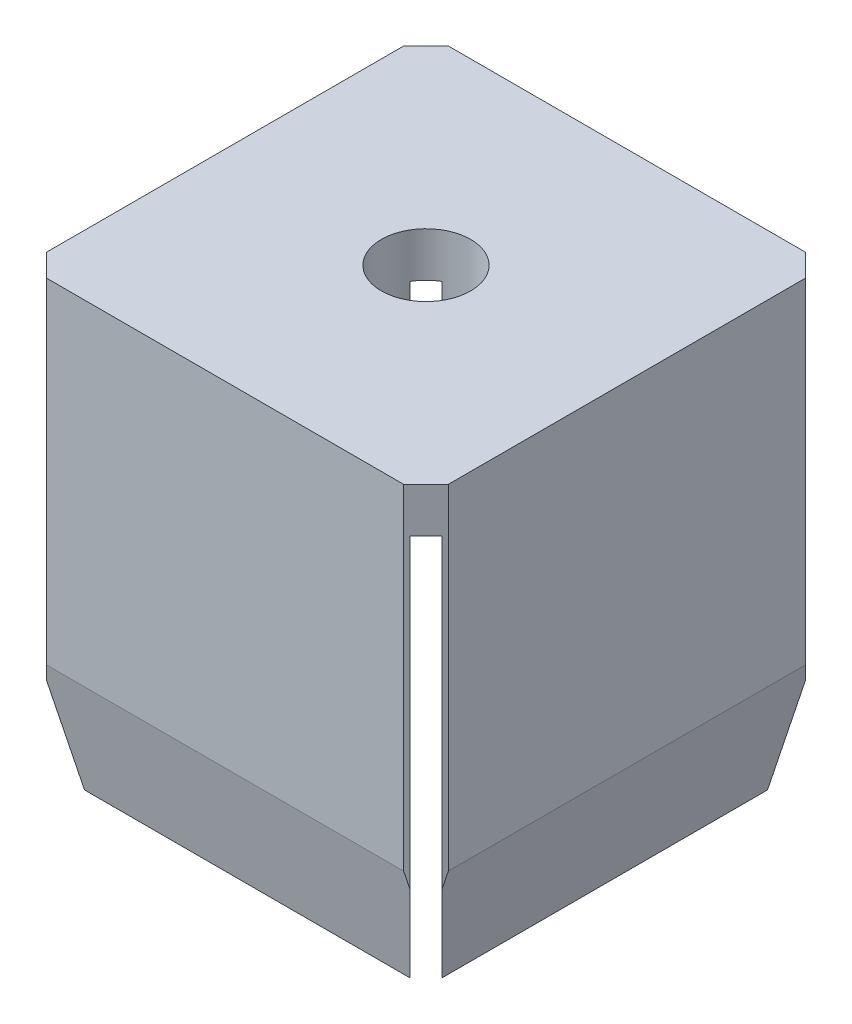
ISO-10303-21;
HEADER;
FILE_DESCRIPTION(('STEP AP214'),'2;1');
FILE_NAME('part.step','',(''),(''),'','','');
FILE_SCHEMA(('AUTOMOTIVE_DESIGN { 1 0 10303 214 1 1 1 1 }'));
ENDSEC;
DATA;
#1=APPLICATION_CONTEXT('core data for automotive mechanical design processes');
#2=APPLICATION_PROTOCOL_DEFINITION('international standard','automotive_design',2000,#1);
#3=PRODUCT_CONTEXT('',#1,'mechanical');
#4=PRODUCT('Part','Part','',(#3));
#5=PRODUCT_RELATED_PRODUCT_CATEGORY('part','',(#4));
#6=PRODUCT_DEFINITION_FORMATION('','',#4);
#7=PRODUCT_DEFINITION_CONTEXT('part definition',#1,'design');
#8=PRODUCT_DEFINITION('design','',#6,#7);
#9=PRODUCT_DEFINITION_SHAPE('','',#8);
#10=(LENGTH_UNIT() NAMED_UNIT(*) SI_UNIT(.MILLI.,.METRE.));
#11=(NAMED_UNIT(*) PLANE_ANGLE_UNIT() SI_UNIT($,.RADIAN.));
#12=(NAMED_UNIT(*) SI_UNIT($,.STERADIAN.) SOLID_ANGLE_UNIT());
#13=UNCERTAINTY_MEASURE_WITH_UNIT(LENGTH_MEASURE(1.E-05),#10,'distance_accuracy_value','');
#14=(GEOMETRIC_REPRESENTATION_CONTEXT(3) GLOBAL_UNCERTAINTY_ASSIGNED_CONTEXT((#13)) GLOBAL_UNIT_ASSIGNED_CONTEXT((#10,
#11,#12)) REPRESENTATION_CONTEXT('',''));
#15=CARTESIAN_POINT('',(0.,0.,0.));
#16=DIRECTION('',(0.,0.,1.));
#17=DIRECTION('',(1.,0.,0.));
#18=AXIS2_PLACEMENT_3D('',#15,#16,#17);
#19=CARTESIAN_POINT('',(0.,0.,0.));
#20=DIRECTION('',(0.,-1.,0.));
#21=DIRECTION('',(0.,0.,-1.));
#22=AXIS2_PLACEMENT_3D('',#19,#20,#21);
#23=PLANE('',#22);
#24=DIRECTION('',(0.707106781186548,0.,-0.707106781186547));
#25=VECTOR('',#24,1.);
#26=CARTESIAN_POINT('',(1.4142135623731,0.,0.));
#27=LINE('',#26,#25);
#28=CARTESIAN_POINT('',(3.44571956871237,0.,-2.03150600633928));
#29=VERTEX_POINT('',#28);
#30=CARTESIAN_POINT('',(16.,0.,-14.5857864376269));
#31=VERTEX_POINT('',#30);
#32=EDGE_CURVE('E474',#29,#31,#27,.T.);
#33=ORIENTED_EDGE('',*,*,#32,.T.);
#34=DIRECTION('',(0.,0.,1.));
#35=VECTOR('',#34,1.);
#36=CARTESIAN_POINT('',(16.,0.,16.));
#37=LINE('',#36,#35);
#38=CARTESIAN_POINT('',(16.,0.,14.5857864376269));
#39=VERTEX_POINT('',#38);
#40=EDGE_CURVE('E387',#31,#39,#37,.T.);
#41=ORIENTED_EDGE('',*,*,#40,.T.);
#42=DIRECTION('',(-0.707106781186548,0.,-0.707106781186548));
#43=VECTOR('',#42,1.);
#44=CARTESIAN_POINT('',(1.4142135623731,0.,0.));
#45=LINE('',#44,#43);
#46=CARTESIAN_POINT('',(3.44571956871238,0.,2.03150600633927));
#47=VERTEX_POINT('',#46);
#48=EDGE_CURVE('E472',#39,#47,#45,.T.);
#49=ORIENTED_EDGE('',*,*,#48,.T.);
#50=CARTESIAN_POINT('',(0.,0.,0.));
#51=DIRECTION('',(0.,1.,0.));
#52=DIRECTION('',(0.,0.,1.));
#53=AXIS2_PLACEMENT_3D('',#50,#51,#52);
#54=CIRCLE('',#53,4.);
#55=EDGE_CURVE('E263',#47,#29,#54,.T.);
#56=ORIENTED_EDGE('',*,*,#55,.T.);
#57=EDGE_LOOP('',(#33,#41,#49,#56));
#58=FACE_BOUND('',#57,.T.);
#59=ADVANCED_FACE('F47',(#58),#23,.T.);
#60=DIRECTION('',(-0.707106781186548,0.,-0.707106781186547));
#61=VECTOR('',#60,1.);
#62=CARTESIAN_POINT('',(-18.5857864376269,0.,-20.));
#63=LINE('',#62,#61);
#64=CARTESIAN_POINT('',(-2.03150600633928,0.,-3.44571956871238));
#65=VERTEX_POINT('',#64);
#66=CARTESIAN_POINT('',(-14.5857864376269,0.,-16.));
#67=VERTEX_POINT('',#66);
#68=EDGE_CURVE('E281',#65,#67,#63,.T.);
#69=ORIENTED_EDGE('',*,*,#68,.T.);
#70=DIRECTION('',(1.,0.,0.));
#71=VECTOR('',#70,1.);
#72=CARTESIAN_POINT('',(16.,0.,-16.));
#73=LINE('',#72,#71);
#74=CARTESIAN_POINT('',(14.5857864376269,0.,-16.));
#75=VERTEX_POINT('',#74);
#76=EDGE_CURVE('E374',#67,#75,#73,.T.);
#77=ORIENTED_EDGE('',*,*,#76,.T.);
#78=DIRECTION('',(-0.707106781186548,0.,0.707106781186547));
#79=VECTOR('',#78,1.);
#80=CARTESIAN_POINT('',(0.,0.,-1.4142135623731));
#81=LINE('',#80,#79);
#82=CARTESIAN_POINT('',(2.03150600633928,0.,-3.44571956871238));
#83=VERTEX_POINT('',#82);
#84=EDGE_CURVE('E284',#75,#83,#81,.T.);
#85=ORIENTED_EDGE('',*,*,#84,.T.);
#86=EDGE_CURVE('E265',#83,#65,#54,.T.);
#87=ORIENTED_EDGE('',*,*,#86,.T.);
#88=EDGE_LOOP('',(#69,#77,#85,#87));
#89=FACE_BOUND('',#88,.T.);
#90=ADVANCED_FACE('F280',(#89),#23,.T.);
#91=DIRECTION('',(-0.707106781186548,0.,0.707106781186548));
#92=VECTOR('',#91,1.);
#93=CARTESIAN_POINT('',(-20.,0.,18.5857864376269));
#94=LINE('',#93,#92);
#95=CARTESIAN_POINT('',(-3.44571956871238,0.,2.03150600633929));
#96=VERTEX_POINT('',#95);
#97=CARTESIAN_POINT('',(-16.,0.,14.5857864376269));
#98=VERTEX_POINT('',#97);
#99=EDGE_CURVE('E479',#96,#98,#94,.T.);
#100=ORIENTED_EDGE('',*,*,#99,.T.);
#101=DIRECTION('',(0.,0.,-1.));
#102=VECTOR('',#101,1.);
#103=CARTESIAN_POINT('',(-16.,0.,-16.));
#104=LINE('',#103,#102);
#105=CARTESIAN_POINT('',(-16.,0.,-14.5857864376269));
#106=VERTEX_POINT('',#105);
#107=EDGE_CURVE('E55',#98,#106,#104,.T.);
#108=ORIENTED_EDGE('',*,*,#107,.T.);
#109=DIRECTION('',(0.707106781186548,0.,0.707106781186547));
#110=VECTOR('',#109,1.);
#111=CARTESIAN_POINT('',(-20.,0.,-18.5857864376269));
#112=LINE('',#111,#110);
#113=CARTESIAN_POINT('',(-3.44571956871238,0.,-2.03150600633929));
#114=VERTEX_POINT('',#113);
#115=EDGE_CURVE('E460',#106,#114,#112,.T.);
#116=ORIENTED_EDGE('',*,*,#115,.T.);
#117=EDGE_CURVE('E260',#114,#96,#54,.T.);
#118=ORIENTED_EDGE('',*,*,#117,.T.);
#119=EDGE_LOOP('',(#100,#108,#116,#118));
#120=FACE_BOUND('',#119,.T.);
#121=ADVANCED_FACE('F481',(#120),#23,.T.);
#122=DIRECTION('',(0.707106781186548,0.,0.707106781186547));
#123=VECTOR('',#122,1.);
#124=CARTESIAN_POINT('',(0.,0.,1.4142135623731));
#125=LINE('',#124,#123);
#126=CARTESIAN_POINT('',(2.03150600633928,0.,3.44571956871237));
#127=VERTEX_POINT('',#126);
#128=CARTESIAN_POINT('',(14.5857864376269,0.,16.));
#129=VERTEX_POINT('',#128);
#130=EDGE_CURVE('E231',#127,#129,#125,.T.);
#131=ORIENTED_EDGE('',*,*,#130,.T.);
#132=DIRECTION('',(-1.,0.,0.));
#133=VECTOR('',#132,1.);
#134=CARTESIAN_POINT('',(-16.,0.,16.));
#135=LINE('',#134,#133);
#136=CARTESIAN_POINT('',(-14.5857864376269,0.,16.));
#137=VERTEX_POINT('',#136);
#138=EDGE_CURVE('E399',#129,#137,#135,.T.);
#139=ORIENTED_EDGE('',*,*,#138,.T.);
#140=DIRECTION('',(0.707106781186548,0.,-0.707106781186548));
#141=VECTOR('',#140,1.);
#142=CARTESIAN_POINT('',(-18.5857864376269,0.,20.));
#143=LINE('',#142,#141);
#144=CARTESIAN_POINT('',(-2.03150600633928,0.,3.44571956871238));
#145=VERTEX_POINT('',#144);
#146=EDGE_CURVE('E244',#137,#145,#143,.T.);
#147=ORIENTED_EDGE('',*,*,#146,.T.);
#148=EDGE_CURVE('E251',#145,#127,#54,.T.);
#149=ORIENTED_EDGE('',*,*,#148,.T.);
#150=EDGE_LOOP('',(#131,#139,#147,#149));
#151=FACE_BOUND('',#150,.T.);
#152=ADVANCED_FACE('F257',(#151),#23,.T.);
#153=CARTESIAN_POINT('',(18.,40.,18.));
#154=DIRECTION('',(-1.,0.,0.));
#155=DIRECTION('',(0.,0.,1.));
#156=AXIS2_PLACEMENT_3D('',#153,#154,#155);
#157=PLANE('',#156);
#158=DIRECTION('',(0.,-1.,0.));
#159=VECTOR('',#158,1.);
#160=CARTESIAN_POINT('',(18.,40.,16.));
#161=LINE('',#160,#159);
#162=CARTESIAN_POINT('',(18.,40.,16.));
#163=VERTEX_POINT('',#162);
#164=CARTESIAN_POINT('',(18.,10.0000000000002,16.));
#165=VERTEX_POINT('',#164);
#166=EDGE_CURVE('E343',#163,#165,#161,.T.);
#167=ORIENTED_EDGE('',*,*,#166,.T.);
#168=DIRECTION('',(0.,0.,-1.));
#169=VECTOR('',#168,1.);
#170=CARTESIAN_POINT('',(18.,10.0000000000002,-16.));
#171=LINE('',#170,#169);
#172=CARTESIAN_POINT('',(18.,10.0000000000002,-16.));
#173=VERTEX_POINT('',#172);
#174=EDGE_CURVE('E382',#165,#173,#171,.T.);
#175=ORIENTED_EDGE('',*,*,#174,.T.);
#176=DIRECTION('',(0.,1.,0.));
#177=VECTOR('',#176,1.);
#178=CARTESIAN_POINT('',(18.,40.,-16.));
#179=LINE('',#178,#177);
#180=CARTESIAN_POINT('',(18.,40.,-16.));
#181=VERTEX_POINT('',#180);
#182=EDGE_CURVE('E346',#173,#181,#179,.T.);
#183=ORIENTED_EDGE('',*,*,#182,.T.);
#184=DIRECTION('',(0.,0.,-1.));
#185=VECTOR('',#184,1.);
#186=CARTESIAN_POINT('',(18.,40.,18.));
#187=LINE('',#186,#185);
#188=EDGE_CURVE('E275',#163,#181,#187,.T.);
#189=ORIENTED_EDGE('',*,*,#188,.F.);
#190=EDGE_LOOP('',(#167,#175,#183,#189));
#191=FACE_BOUND('',#190,.T.);
#192=ADVANCED_FACE('F554',(#191),#157,.F.);
#193=CARTESIAN_POINT('',(-18.,40.,-18.));
#194=DIRECTION('',(0.,0.,1.));
#195=DIRECTION('',(1.,0.,0.));
#196=AXIS2_PLACEMENT_3D('',#193,#194,#195);
#197=PLANE('',#196);
#198=DIRECTION('',(0.,-1.,0.));
#199=VECTOR('',#198,1.);
#200=CARTESIAN_POINT('',(16.,40.,-18.));
#201=LINE('',#200,#199);
#202=CARTESIAN_POINT('',(16.,40.,-18.));
#203=VERTEX_POINT('',#202);
#204=CARTESIAN_POINT('',(16.,10.0000000000002,-18.));
#205=VERTEX_POINT('',#204);
#206=EDGE_CURVE('E323',#203,#205,#201,.T.);
#207=ORIENTED_EDGE('',*,*,#206,.T.);
#208=DIRECTION('',(-1.,0.,0.));
#209=VECTOR('',#208,1.);
#210=CARTESIAN_POINT('',(-16.,10.0000000000002,-18.));
#211=LINE('',#210,#209);
#212=CARTESIAN_POINT('',(-16.,10.0000000000002,-18.));
#213=VERTEX_POINT('',#212);
#214=EDGE_CURVE('E365',#205,#213,#211,.T.);
#215=ORIENTED_EDGE('',*,*,#214,.T.);
#216=DIRECTION('',(0.,1.,0.));
#217=VECTOR('',#216,1.);
#218=CARTESIAN_POINT('',(-16.,40.,-18.));
#219=LINE('',#218,#217);
#220=CARTESIAN_POINT('',(-16.,40.,-18.));
#221=VERTEX_POINT('',#220);
#222=EDGE_CURVE('E326',#213,#221,#219,.T.);
#223=ORIENTED_EDGE('',*,*,#222,.T.);
#224=DIRECTION('',(-1.,0.,0.));
#225=VECTOR('',#224,1.);
#226=CARTESIAN_POINT('',(-18.,40.,-18.));
#227=LINE('',#226,#225);
#228=EDGE_CURVE('E442',#203,#221,#227,.T.);
#229=ORIENTED_EDGE('',*,*,#228,.F.);
#230=EDGE_LOOP('',(#207,#215,#223,#229));
#231=FACE_BOUND('',#230,.T.);
#232=ADVANCED_FACE('F559',(#231),#197,.F.);
#233=CARTESIAN_POINT('',(-18.,40.,18.));
#234=DIRECTION('',(1.,0.,0.));
#235=DIRECTION('',(0.,0.,-1.));
#236=AXIS2_PLACEMENT_3D('',#233,#234,#235);
#237=PLANE('',#236);
#238=DIRECTION('',(0.,-1.,0.));
#239=VECTOR('',#238,1.);
#240=CARTESIAN_POINT('',(-18.,40.,-16.));
#241=LINE('',#240,#239);
#242=CARTESIAN_POINT('',(-18.,40.,-16.));
#243=VERTEX_POINT('',#242);
#244=CARTESIAN_POINT('',(-18.,10.0000000000002,-16.));
#245=VERTEX_POINT('',#244);
#246=EDGE_CURVE('E313',#243,#245,#241,.T.);
#247=ORIENTED_EDGE('',*,*,#246,.T.);
#248=DIRECTION('',(0.,0.,1.));
#249=VECTOR('',#248,1.);
#250=CARTESIAN_POINT('',(-18.,10.0000000000002,16.));
#251=LINE('',#250,#249);
#252=CARTESIAN_POINT('',(-18.,10.0000000000002,16.));
#253=VERTEX_POINT('',#252);
#254=EDGE_CURVE('E407',#245,#253,#251,.T.);
#255=ORIENTED_EDGE('',*,*,#254,.T.);
#256=DIRECTION('',(0.,1.,0.));
#257=VECTOR('',#256,1.);
#258=CARTESIAN_POINT('',(-18.,40.,16.));
#259=LINE('',#258,#257);
#260=CARTESIAN_POINT('',(-18.,40.,16.));
#261=VERTEX_POINT('',#260);
#262=EDGE_CURVE('E311',#253,#261,#259,.T.);
#263=ORIENTED_EDGE('',*,*,#262,.T.);
#264=DIRECTION('',(0.,0.,1.));
#265=VECTOR('',#264,1.);
#266=CARTESIAN_POINT('',(-18.,40.,18.));
#267=LINE('',#266,#265);
#268=EDGE_CURVE('E433',#243,#261,#267,.T.);
#269=ORIENTED_EDGE('',*,*,#268,.F.);
#270=EDGE_LOOP('',(#247,#255,#263,#269));
#271=FACE_BOUND('',#270,.T.);
#272=ADVANCED_FACE('F413',(#271),#237,.F.);
#273=CARTESIAN_POINT('',(-18.,40.,18.));
#274=DIRECTION('',(0.,0.,-1.));
#275=DIRECTION('',(-1.,0.,0.));
#276=AXIS2_PLACEMENT_3D('',#273,#274,#275);
#277=PLANE('',#276);
#278=DIRECTION('',(0.,-1.,0.));
#279=VECTOR('',#278,1.);
#280=CARTESIAN_POINT('',(-16.,40.,18.));
#281=LINE('',#280,#279);
#282=CARTESIAN_POINT('',(-16.,40.,18.));
#283=VERTEX_POINT('',#282);
#284=CARTESIAN_POINT('',(-16.,10.0000000000002,18.));
#285=VERTEX_POINT('',#284);
#286=EDGE_CURVE('E350',#283,#285,#281,.T.);
#287=ORIENTED_EDGE('',*,*,#286,.T.);
#288=DIRECTION('',(1.,0.,0.));
#289=VECTOR('',#288,1.);
#290=CARTESIAN_POINT('',(16.,10.0000000000002,18.));
#291=LINE('',#290,#289);
#292=CARTESIAN_POINT('',(16.,10.0000000000002,18.));
#293=VERTEX_POINT('',#292);
#294=EDGE_CURVE('E395',#285,#293,#291,.T.);
#295=ORIENTED_EDGE('',*,*,#294,.T.);
#296=DIRECTION('',(0.,1.,0.));
#297=VECTOR('',#296,1.);
#298=CARTESIAN_POINT('',(16.,40.,18.));
#299=LINE('',#298,#297);
#300=CARTESIAN_POINT('',(16.,40.,18.));
#301=VERTEX_POINT('',#300);
#302=EDGE_CURVE('E348',#293,#301,#299,.T.);
#303=ORIENTED_EDGE('',*,*,#302,.T.);
#304=DIRECTION('',(1.,0.,0.));
#305=VECTOR('',#304,1.);
#306=CARTESIAN_POINT('',(-18.,40.,18.));
#307=LINE('',#306,#305);
#308=EDGE_CURVE('E431',#283,#301,#307,.T.);
#309=ORIENTED_EDGE('',*,*,#308,.F.);
#310=EDGE_LOOP('',(#287,#295,#303,#309));
#311=FACE_BOUND('',#310,.T.);
#312=ADVANCED_FACE('F435',(#311),#277,.F.);
#313=CARTESIAN_POINT('',(0.,40.,0.));
#314=DIRECTION('',(0.,-1.,0.));
#315=DIRECTION('',(0.,0.,-1.));
#316=AXIS2_PLACEMENT_3D('',#313,#314,#315);
#317=CYLINDRICAL_SURFACE('',#316,4.);
#318=CARTESIAN_POINT('',(0.,40.,0.));
#319=DIRECTION('',(0.,1.,0.));
#320=DIRECTION('',(0.,0.,1.));
#321=AXIS2_PLACEMENT_3D('',#318,#319,#320);
#322=CIRCLE('',#321,4.);
#323=CARTESIAN_POINT('',(0.,40.,4.));
#324=VERTEX_POINT('',#323);
#325=EDGE_CURVE('E271',#324,#324,#322,.T.);
#326=ORIENTED_EDGE('',*,*,#325,.T.);
#327=EDGE_LOOP('',(#326));
#328=FACE_BOUND('',#327,.T.);
#329=ORIENTED_EDGE('',*,*,#55,.F.);
#330=DIRECTION('',(0.,-1.,0.));
#331=VECTOR('',#330,1.);
#332=CARTESIAN_POINT('',(3.44571956871238,40.,2.03150600633927));
#333=LINE('',#332,#331);
#334=CARTESIAN_POINT('',(3.44571956871238,36.,2.03150600633927));
#335=VERTEX_POINT('',#334);
#336=EDGE_CURVE('E255',#47,#335,#333,.F.);
#337=ORIENTED_EDGE('',*,*,#336,.T.);
#338=CARTESIAN_POINT('',(0.,36.,0.));
#339=DIRECTION('',(0.,1.,0.));
#340=DIRECTION('',(0.,0.,1.));
#341=AXIS2_PLACEMENT_3D('',#338,#339,#340);
#342=CIRCLE('',#341,4.);
#343=CARTESIAN_POINT('',(2.03150600633928,36.,3.44571956871237));
#344=VERTEX_POINT('',#343);
#345=EDGE_CURVE('E254',#344,#335,#342,.T.);
#346=ORIENTED_EDGE('',*,*,#345,.F.);
#347=DIRECTION('',(0.,-1.,0.));
#348=VECTOR('',#347,1.);
#349=CARTESIAN_POINT('',(2.03150600633928,40.,3.44571956871238));
#350=LINE('',#349,#348);
#351=EDGE_CURVE('E236',#344,#127,#350,.T.);
#352=ORIENTED_EDGE('',*,*,#351,.T.);
#353=ORIENTED_EDGE('',*,*,#148,.F.);
#354=DIRECTION('',(0.,-1.,0.));
#355=VECTOR('',#354,1.);
#356=CARTESIAN_POINT('',(-2.03150600633928,40.,3.44571956871238));
#357=LINE('',#356,#355);
#358=CARTESIAN_POINT('',(-2.03150600633928,36.,3.44571956871238));
#359=VERTEX_POINT('',#358);
#360=EDGE_CURVE('E441',#145,#359,#357,.F.);
#361=ORIENTED_EDGE('',*,*,#360,.T.);
#362=CARTESIAN_POINT('',(-3.44571956871238,36.,2.03150600633929));
#363=VERTEX_POINT('',#362);
#364=EDGE_CURVE('E438',#363,#359,#342,.T.);
#365=ORIENTED_EDGE('',*,*,#364,.F.);
#366=DIRECTION('',(0.,-1.,0.));
#367=VECTOR('',#366,1.);
#368=CARTESIAN_POINT('',(-3.44571956871238,40.,2.03150600633928));
#369=LINE('',#368,#367);
#370=EDGE_CURVE('E446',#363,#96,#369,.T.);
#371=ORIENTED_EDGE('',*,*,#370,.T.);
#372=ORIENTED_EDGE('',*,*,#117,.F.);
#373=DIRECTION('',(0.,-1.,0.));
#374=VECTOR('',#373,1.);
#375=CARTESIAN_POINT('',(-3.44571956871238,40.,-2.03150600633929));
#376=LINE('',#375,#374);
#377=CARTESIAN_POINT('',(-3.44571956871238,36.,-2.03150600633929));
#378=VERTEX_POINT('',#377);
#379=EDGE_CURVE('E299',#114,#378,#376,.F.);
#380=ORIENTED_EDGE('',*,*,#379,.T.);
#381=CARTESIAN_POINT('',(-2.03150600633928,36.,-3.44571956871238));
#382=VERTEX_POINT('',#381);
#383=EDGE_CURVE('E295',#382,#378,#342,.T.);
#384=ORIENTED_EDGE('',*,*,#383,.F.);
#385=DIRECTION('',(0.,-1.,0.));
#386=VECTOR('',#385,1.);
#387=CARTESIAN_POINT('',(-2.03150600633928,40.,-3.44571956871238));
#388=LINE('',#387,#386);
#389=EDGE_CURVE('E292',#382,#65,#388,.T.);
#390=ORIENTED_EDGE('',*,*,#389,.T.);
#391=ORIENTED_EDGE('',*,*,#86,.F.);
#392=DIRECTION('',(0.,-1.,0.));
#393=VECTOR('',#392,1.);
#394=CARTESIAN_POINT('',(2.03150600633928,40.,-3.44571956871238));
#395=LINE('',#394,#393);
#396=CARTESIAN_POINT('',(2.03150600633928,36.,-3.44571956871238));
#397=VERTEX_POINT('',#396);
#398=EDGE_CURVE('E289',#83,#397,#395,.F.);
#399=ORIENTED_EDGE('',*,*,#398,.T.);
#400=CARTESIAN_POINT('',(3.44571956871237,36.,-2.03150600633928));
#401=VERTEX_POINT('',#400);
#402=EDGE_CURVE('E298',#401,#397,#342,.T.);
#403=ORIENTED_EDGE('',*,*,#402,.F.);
#404=DIRECTION('',(0.,-1.,0.));
#405=VECTOR('',#404,1.);
#406=CARTESIAN_POINT('',(3.44571956871237,40.,-2.03150600633928));
#407=LINE('',#406,#405);
#408=EDGE_CURVE('E307',#401,#29,#407,.T.);
#409=ORIENTED_EDGE('',*,*,#408,.T.);
#410=EDGE_LOOP('',(#329,#337,#346,#352,#353,#361,#365,#371,#372,#380,#384,#390,#391,#399,#403,#409));
#411=FACE_BOUND('',#410,.T.);
#412=ADVANCED_FACE('F249',(#328,#411),#317,.F.);
#413=CARTESIAN_POINT('',(0.,40.,0.));
#414=DIRECTION('',(0.,-1.,0.));
#415=DIRECTION('',(0.,0.,-1.));
#416=AXIS2_PLACEMENT_3D('',#413,#414,#415);
#417=PLANE('',#416);
#418=ORIENTED_EDGE('',*,*,#228,.T.);
#419=DIRECTION('',(0.707106781186548,0.,-0.707106781186548));
#420=VECTOR('',#419,1.);
#421=CARTESIAN_POINT('',(-18.,40.,-16.));
#422=LINE('',#421,#420);
#423=EDGE_CURVE('E334',#221,#243,#422,.F.);
#424=ORIENTED_EDGE('',*,*,#423,.T.);
#425=ORIENTED_EDGE('',*,*,#268,.T.);
#426=DIRECTION('',(-0.707106781186548,0.,-0.707106781186548));
#427=VECTOR('',#426,1.);
#428=CARTESIAN_POINT('',(-16.,40.,18.));
#429=LINE('',#428,#427);
#430=EDGE_CURVE('E330',#261,#283,#429,.F.);
#431=ORIENTED_EDGE('',*,*,#430,.T.);
#432=ORIENTED_EDGE('',*,*,#308,.T.);
#433=DIRECTION('',(-0.707106781186548,0.,0.707106781186548));
#434=VECTOR('',#433,1.);
#435=CARTESIAN_POINT('',(18.,40.,16.));
#436=LINE('',#435,#434);
#437=EDGE_CURVE('E328',#301,#163,#436,.F.);
#438=ORIENTED_EDGE('',*,*,#437,.T.);
#439=ORIENTED_EDGE('',*,*,#188,.T.);
#440=DIRECTION('',(0.707106781186548,0.,0.707106781186548));
#441=VECTOR('',#440,1.);
#442=CARTESIAN_POINT('',(16.,40.,-18.));
#443=LINE('',#442,#441);
#444=EDGE_CURVE('E332',#181,#203,#443,.F.);
#445=ORIENTED_EDGE('',*,*,#444,.T.);
#446=EDGE_LOOP('',(#418,#424,#425,#431,#432,#438,#439,#445));
#447=FACE_BOUND('',#446,.T.);
#448=ORIENTED_EDGE('',*,*,#325,.F.);
#449=EDGE_LOOP('',(#448));
#450=FACE_BOUND('',#449,.T.);
#451=ADVANCED_FACE('F429',(#447,#450),#417,.F.);
#452=CARTESIAN_POINT('',(0.,36.,0.));
#453=DIRECTION('',(0.,1.,0.));
#454=DIRECTION('',(0.,0.,1.));
#455=AXIS2_PLACEMENT_3D('',#452,#453,#454);
#456=PLANE('',#455);
#457=DIRECTION('',(0.707106781186548,0.,-0.707106781186548));
#458=VECTOR('',#457,1.);
#459=CARTESIAN_POINT('',(-18.5857864376269,36.,20.));
#460=LINE('',#459,#458);
#461=CARTESIAN_POINT('',(-16.2928932188134,36.,17.7071067811865));
#462=VERTEX_POINT('',#461);
#463=EDGE_CURVE('E266',#462,#359,#460,.T.);
#464=ORIENTED_EDGE('',*,*,#463,.F.);
#465=DIRECTION('',(0.707106781186548,0.,0.707106781186548));
#466=VECTOR('',#465,1.);
#467=CARTESIAN_POINT('',(-16.,36.,18.));
#468=LINE('',#467,#466);
#469=CARTESIAN_POINT('',(-17.7071067811865,36.,16.2928932188134));
#470=VERTEX_POINT('',#469);
#471=EDGE_CURVE('E355',#462,#470,#468,.F.);
#472=ORIENTED_EDGE('',*,*,#471,.T.);
#473=DIRECTION('',(-0.707106781186548,0.,0.707106781186548));
#474=VECTOR('',#473,1.);
#475=CARTESIAN_POINT('',(-20.,36.,18.5857864376269));
#476=LINE('',#475,#474);
#477=EDGE_CURVE('E463',#363,#470,#476,.T.);
#478=ORIENTED_EDGE('',*,*,#477,.F.);
#479=ORIENTED_EDGE('',*,*,#364,.T.);
#480=EDGE_LOOP('',(#464,#472,#478,#479));
#481=FACE_BOUND('',#480,.T.);
#482=ADVANCED_FACE('F534',(#481),#456,.F.);
#483=CARTESIAN_POINT('',(-18.5857864376269,36.,20.));
#484=DIRECTION('',(-0.707106781186547,0.,-0.707106781186547));
#485=DIRECTION('',(-0.707106781186548,0.,0.707106781186548));
#486=AXIS2_PLACEMENT_3D('',#483,#484,#485);
#487=PLANE('',#486);
#488=ORIENTED_EDGE('',*,*,#146,.F.);
#489=DIRECTION('',(-0.192450089729872,0.962250448649377,0.192450089729872));
#490=VECTOR('',#489,1.);
#491=CARTESIAN_POINT('',(-21.5487494005897,34.8148148148149,22.9629629629628));
#492=LINE('',#491,#490);
#493=CARTESIAN_POINT('',(-16.2928932188134,8.53553390593288,17.7071067811865));
#494=VERTEX_POINT('',#493);
#495=EDGE_CURVE('E401',#137,#494,#492,.T.);
#496=ORIENTED_EDGE('',*,*,#495,.T.);
#497=DIRECTION('',(0.,-1.,0.));
#498=VECTOR('',#497,1.);
#499=CARTESIAN_POINT('',(-16.2928932188134,36.,17.7071067811865));
#500=LINE('',#499,#498);
#501=EDGE_CURVE('E353',#494,#462,#500,.F.);
#502=ORIENTED_EDGE('',*,*,#501,.T.);
#503=ORIENTED_EDGE('',*,*,#463,.T.);
#504=ORIENTED_EDGE('',*,*,#360,.F.);
#505=EDGE_LOOP('',(#488,#496,#502,#503,#504));
#506=FACE_BOUND('',#505,.T.);
#507=ADVANCED_FACE('F531',(#506),#487,.T.);
#508=CARTESIAN_POINT('',(-20.,36.,18.5857864376269));
#509=DIRECTION('',(0.707106781186548,0.,0.707106781186547));
#510=DIRECTION('',(0.707106781186547,0.,-0.707106781186548));
#511=AXIS2_PLACEMENT_3D('',#508,#509,#510);
#512=PLANE('',#511);
#513=DIRECTION('',(0.,1.,0.));
#514=VECTOR('',#513,1.);
#515=CARTESIAN_POINT('',(-17.7071067811865,36.,16.2928932188134));
#516=LINE('',#515,#514);
#517=CARTESIAN_POINT('',(-17.7071067811865,8.53553390593285,16.2928932188134));
#518=VERTEX_POINT('',#517);
#519=EDGE_CURVE('E357',#470,#518,#516,.F.);
#520=ORIENTED_EDGE('',*,*,#519,.T.);
#521=DIRECTION('',(0.192450089729872,-0.962250448649377,-0.192450089729872));
#522=VECTOR('',#521,1.);
#523=CARTESIAN_POINT('',(-22.9629629629629,34.8148148148149,21.5487494005898));
#524=LINE('',#523,#522);
#525=EDGE_CURVE('E69',#518,#98,#524,.T.);
#526=ORIENTED_EDGE('',*,*,#525,.T.);
#527=ORIENTED_EDGE('',*,*,#99,.F.);
#528=ORIENTED_EDGE('',*,*,#370,.F.);
#529=ORIENTED_EDGE('',*,*,#477,.T.);
#530=EDGE_LOOP('',(#520,#526,#527,#528,#529));
#531=FACE_BOUND('',#530,.T.);
#532=ADVANCED_FACE('F536',(#531),#512,.T.);
#533=DIRECTION('',(0.707106781186548,0.,0.707106781186547));
#534=VECTOR('',#533,1.);
#535=CARTESIAN_POINT('',(-20.,36.,-18.5857864376269));
#536=LINE('',#535,#534);
#537=CARTESIAN_POINT('',(-17.7071067811865,36.,-16.2928932188134));
#538=VERTEX_POINT('',#537);
#539=EDGE_CURVE('E454',#538,#378,#536,.T.);
#540=ORIENTED_EDGE('',*,*,#539,.F.);
#541=DIRECTION('',(-0.707106781186548,0.,0.707106781186548));
#542=VECTOR('',#541,1.);
#543=CARTESIAN_POINT('',(-18.,36.,-16.));
#544=LINE('',#543,#542);
#545=CARTESIAN_POINT('',(-16.2928932188134,36.,-17.7071067811865));
#546=VERTEX_POINT('',#545);
#547=EDGE_CURVE('E318',#538,#546,#544,.F.);
#548=ORIENTED_EDGE('',*,*,#547,.T.);
#549=DIRECTION('',(-0.707106781186548,0.,-0.707106781186547));
#550=VECTOR('',#549,1.);
#551=CARTESIAN_POINT('',(-18.5857864376269,36.,-20.));
#552=LINE('',#551,#550);
#553=EDGE_CURVE('E456',#382,#546,#552,.T.);
#554=ORIENTED_EDGE('',*,*,#553,.F.);
#555=ORIENTED_EDGE('',*,*,#383,.T.);
#556=EDGE_LOOP('',(#540,#548,#554,#555));
#557=FACE_BOUND('',#556,.T.);
#558=ADVANCED_FACE('F453',(#557),#456,.F.);
#559=CARTESIAN_POINT('',(-20.,36.,-18.5857864376269));
#560=DIRECTION('',(0.707106781186547,0.,-0.707106781186548));
#561=DIRECTION('',(-0.707106781186548,0.,-0.707106781186547));
#562=AXIS2_PLACEMENT_3D('',#559,#560,#561);
#563=PLANE('',#562);
#564=ORIENTED_EDGE('',*,*,#115,.F.);
#565=DIRECTION('',(-0.192450089729872,0.962250448649378,-0.192450089729872));
#566=VECTOR('',#565,1.);
#567=CARTESIAN_POINT('',(-22.9629629629629,34.8148148148149,-21.5487494005897));
#568=LINE('',#567,#566);
#569=CARTESIAN_POINT('',(-17.7071067811865,8.53553390593287,-16.2928932188134));
#570=VERTEX_POINT('',#569);
#571=EDGE_CURVE('E13',#106,#570,#568,.T.);
#572=ORIENTED_EDGE('',*,*,#571,.T.);
#573=DIRECTION('',(0.,-1.,0.));
#574=VECTOR('',#573,1.);
#575=CARTESIAN_POINT('',(-17.7071067811865,36.,-16.2928932188134));
#576=LINE('',#575,#574);
#577=EDGE_CURVE('E316',#570,#538,#576,.F.);
#578=ORIENTED_EDGE('',*,*,#577,.T.);
#579=ORIENTED_EDGE('',*,*,#539,.T.);
#580=ORIENTED_EDGE('',*,*,#379,.F.);
#581=EDGE_LOOP('',(#564,#572,#578,#579,#580));
#582=FACE_BOUND('',#581,.T.);
#583=ADVANCED_FACE('F459',(#582),#563,.T.);
#584=CARTESIAN_POINT('',(-18.5857864376269,36.,-20.));
#585=DIRECTION('',(-0.707106781186547,0.,0.707106781186548));
#586=DIRECTION('',(0.707106781186548,0.,0.707106781186547));
#587=AXIS2_PLACEMENT_3D('',#584,#585,#586);
#588=PLANE('',#587);
#589=DIRECTION('',(0.,1.,0.));
#590=VECTOR('',#589,1.);
#591=CARTESIAN_POINT('',(-16.2928932188134,36.,-17.7071067811865));
#592=LINE('',#591,#590);
#593=CARTESIAN_POINT('',(-16.2928932188135,8.53553390593287,-17.7071067811865));
#594=VERTEX_POINT('',#593);
#595=EDGE_CURVE('E320',#546,#594,#592,.F.);
#596=ORIENTED_EDGE('',*,*,#595,.T.);
#597=DIRECTION('',(0.192450089729872,-0.962250448649377,0.192450089729872));
#598=VECTOR('',#597,1.);
#599=CARTESIAN_POINT('',(-21.5487494005898,34.8148148148149,-22.9629629629628));
#600=LINE('',#599,#598);
#601=EDGE_CURVE('E372',#594,#67,#600,.T.);
#602=ORIENTED_EDGE('',*,*,#601,.T.);
#603=ORIENTED_EDGE('',*,*,#68,.F.);
#604=ORIENTED_EDGE('',*,*,#389,.F.);
#605=ORIENTED_EDGE('',*,*,#553,.T.);
#606=EDGE_LOOP('',(#596,#602,#603,#604,#605));
#607=FACE_BOUND('',#606,.T.);
#608=ADVANCED_FACE('F486',(#607),#588,.T.);
#609=DIRECTION('',(-0.707106781186548,0.,0.707106781186547));
#610=VECTOR('',#609,1.);
#611=CARTESIAN_POINT('',(0.,36.,-1.4142135623731));
#612=LINE('',#611,#610);
#613=CARTESIAN_POINT('',(16.2928932188134,36.,-17.7071067811865));
#614=VERTEX_POINT('',#613);
#615=EDGE_CURVE('E467',#614,#397,#612,.T.);
#616=ORIENTED_EDGE('',*,*,#615,.F.);
#617=DIRECTION('',(-0.707106781186548,0.,-0.707106781186548));
#618=VECTOR('',#617,1.);
#619=CARTESIAN_POINT('',(16.,36.,-18.));
#620=LINE('',#619,#618);
#621=CARTESIAN_POINT('',(17.7071067811865,36.,-16.2928932188134));
#622=VERTEX_POINT('',#621);
#623=EDGE_CURVE('E338',#614,#622,#620,.F.);
#624=ORIENTED_EDGE('',*,*,#623,.T.);
#625=DIRECTION('',(0.707106781186548,0.,-0.707106781186547));
#626=VECTOR('',#625,1.);
#627=CARTESIAN_POINT('',(1.4142135623731,36.,0.));
#628=LINE('',#627,#626);
#629=EDGE_CURVE('E499',#401,#622,#628,.T.);
#630=ORIENTED_EDGE('',*,*,#629,.F.);
#631=ORIENTED_EDGE('',*,*,#402,.T.);
#632=EDGE_LOOP('',(#616,#624,#630,#631));
#633=FACE_BOUND('',#632,.T.);
#634=ADVANCED_FACE('F500',(#633),#456,.F.);
#635=CARTESIAN_POINT('',(0.,36.,-1.4142135623731));
#636=DIRECTION('',(0.707106781186547,0.,0.707106781186548));
#637=DIRECTION('',(0.707106781186548,0.,-0.707106781186547));
#638=AXIS2_PLACEMENT_3D('',#635,#636,#637);
#639=PLANE('',#638);
#640=ORIENTED_EDGE('',*,*,#84,.F.);
#641=DIRECTION('',(0.192450089729872,0.962250448649377,-0.192450089729872));
#642=VECTOR('',#641,1.);
#643=CARTESIAN_POINT('',(20.1720244792841,27.9311902082865,-21.5862380416572));
#644=LINE('',#643,#642);
#645=CARTESIAN_POINT('',(16.2928932188134,8.53553390593287,-17.7071067811865));
#646=VERTEX_POINT('',#645);
#647=EDGE_CURVE('E376',#75,#646,#644,.T.);
#648=ORIENTED_EDGE('',*,*,#647,.T.);
#649=DIRECTION('',(0.,-1.,0.));
#650=VECTOR('',#649,1.);
#651=CARTESIAN_POINT('',(16.2928932188134,36.,-17.7071067811865));
#652=LINE('',#651,#650);
#653=EDGE_CURVE('E336',#646,#614,#652,.F.);
#654=ORIENTED_EDGE('',*,*,#653,.T.);
#655=ORIENTED_EDGE('',*,*,#615,.T.);
#656=ORIENTED_EDGE('',*,*,#398,.F.);
#657=EDGE_LOOP('',(#640,#648,#654,#655,#656));
#658=FACE_BOUND('',#657,.T.);
#659=ADVANCED_FACE('F494',(#658),#639,.T.);
#660=CARTESIAN_POINT('',(1.4142135623731,36.,0.));
#661=DIRECTION('',(-0.707106781186547,0.,-0.707106781186548));
#662=DIRECTION('',(-0.707106781186548,0.,0.707106781186547));
#663=AXIS2_PLACEMENT_3D('',#660,#661,#662);
#664=PLANE('',#663);
#665=DIRECTION('',(0.,1.,0.));
#666=VECTOR('',#665,1.);
#667=CARTESIAN_POINT('',(17.7071067811865,36.,-16.2928932188134));
#668=LINE('',#667,#666);
#669=CARTESIAN_POINT('',(17.7071067811865,8.53553390593288,-16.2928932188134));
#670=VERTEX_POINT('',#669);
#671=EDGE_CURVE('E340',#622,#670,#668,.F.);
#672=ORIENTED_EDGE('',*,*,#671,.T.);
#673=DIRECTION('',(-0.192450089729872,-0.962250448649377,0.192450089729872));
#674=VECTOR('',#673,1.);
#675=CARTESIAN_POINT('',(21.5862380416572,27.9311902082865,-20.1720244792841));
#676=LINE('',#675,#674);
#677=EDGE_CURVE('E385',#670,#31,#676,.T.);
#678=ORIENTED_EDGE('',*,*,#677,.T.);
#679=ORIENTED_EDGE('',*,*,#32,.F.);
#680=ORIENTED_EDGE('',*,*,#408,.F.);
#681=ORIENTED_EDGE('',*,*,#629,.T.);
#682=EDGE_LOOP('',(#672,#678,#679,#680,#681));
#683=FACE_BOUND('',#682,.T.);
#684=ADVANCED_FACE('F504',(#683),#664,.T.);
#685=CARTESIAN_POINT('',(1.4142135623731,36.,0.));
#686=DIRECTION('',(-0.707106781186547,0.,0.707106781186548));
#687=DIRECTION('',(0.707106781186548,0.,0.707106781186547));
#688=AXIS2_PLACEMENT_3D('',#685,#686,#687);
#689=PLANE('',#688);
#690=ORIENTED_EDGE('',*,*,#48,.F.);
#691=DIRECTION('',(0.192450089729872,0.962250448649378,0.192450089729872));
#692=VECTOR('',#691,1.);
#693=CARTESIAN_POINT('',(21.5862380416572,27.9311902082865,20.1720244792841));
#694=LINE('',#693,#692);
#695=CARTESIAN_POINT('',(17.7071067811865,8.53553390593293,16.2928932188134));
#696=VERTEX_POINT('',#695);
#697=EDGE_CURVE('E389',#39,#696,#694,.T.);
#698=ORIENTED_EDGE('',*,*,#697,.T.);
#699=DIRECTION('',(0.,-1.,0.));
#700=VECTOR('',#699,1.);
#701=CARTESIAN_POINT('',(17.7071067811865,36.,16.2928932188134));
#702=LINE('',#701,#700);
#703=CARTESIAN_POINT('',(17.7071067811865,36.,16.2928932188134));
#704=VERTEX_POINT('',#703);
#705=EDGE_CURVE('E359',#696,#704,#702,.F.);
#706=ORIENTED_EDGE('',*,*,#705,.T.);
#707=DIRECTION('',(-0.707106781186548,0.,-0.707106781186548));
#708=VECTOR('',#707,1.);
#709=CARTESIAN_POINT('',(1.4142135623731,36.,0.));
#710=LINE('',#709,#708);
#711=EDGE_CURVE('E243',#704,#335,#710,.T.);
#712=ORIENTED_EDGE('',*,*,#711,.T.);
#713=ORIENTED_EDGE('',*,*,#336,.F.);
#714=EDGE_LOOP('',(#690,#698,#706,#712,#713));
#715=FACE_BOUND('',#714,.T.);
#716=ADVANCED_FACE('F516',(#715),#689,.T.);
#717=CARTESIAN_POINT('',(0.,36.,1.4142135623731));
#718=DIRECTION('',(0.707106781186547,0.,-0.707106781186548));
#719=DIRECTION('',(-0.707106781186548,0.,-0.707106781186547));
#720=AXIS2_PLACEMENT_3D('',#717,#718,#719);
#721=PLANE('',#720);
#722=DIRECTION('',(0.,1.,0.));
#723=VECTOR('',#722,1.);
#724=CARTESIAN_POINT('',(16.2928932188134,36.,17.7071067811865));
#725=LINE('',#724,#723);
#726=CARTESIAN_POINT('',(16.2928932188134,36.,17.7071067811865));
#727=VERTEX_POINT('',#726);
#728=CARTESIAN_POINT('',(16.2928932188134,8.53553390593279,17.7071067811865));
#729=VERTEX_POINT('',#728);
#730=EDGE_CURVE('E363',#727,#729,#725,.F.);
#731=ORIENTED_EDGE('',*,*,#730,.T.);
#732=DIRECTION('',(-0.192450089729872,-0.962250448649377,-0.192450089729872));
#733=VECTOR('',#732,1.);
#734=CARTESIAN_POINT('',(20.1720244792841,27.9311902082865,21.5862380416572));
#735=LINE('',#734,#733);
#736=EDGE_CURVE('E239',#729,#129,#735,.T.);
#737=ORIENTED_EDGE('',*,*,#736,.T.);
#738=ORIENTED_EDGE('',*,*,#130,.F.);
#739=ORIENTED_EDGE('',*,*,#351,.F.);
#740=DIRECTION('',(0.707106781186548,0.,0.707106781186547));
#741=VECTOR('',#740,1.);
#742=CARTESIAN_POINT('',(0.,36.,1.4142135623731));
#743=LINE('',#742,#741);
#744=EDGE_CURVE('E261',#344,#727,#743,.T.);
#745=ORIENTED_EDGE('',*,*,#744,.T.);
#746=EDGE_LOOP('',(#731,#737,#738,#739,#745));
#747=FACE_BOUND('',#746,.T.);
#748=ADVANCED_FACE('F234',(#747),#721,.T.);
#749=ORIENTED_EDGE('',*,*,#711,.F.);
#750=DIRECTION('',(0.707106781186548,0.,-0.707106781186548));
#751=VECTOR('',#750,1.);
#752=CARTESIAN_POINT('',(18.,36.,16.));
#753=LINE('',#752,#751);
#754=EDGE_CURVE('E361',#704,#727,#753,.F.);
#755=ORIENTED_EDGE('',*,*,#754,.T.);
#756=ORIENTED_EDGE('',*,*,#744,.F.);
#757=ORIENTED_EDGE('',*,*,#345,.T.);
#758=EDGE_LOOP('',(#749,#755,#756,#757));
#759=FACE_BOUND('',#758,.T.);
#760=ADVANCED_FACE('F525',(#759),#456,.F.);
#761=CARTESIAN_POINT('',(-18.,40.,-16.));
#762=DIRECTION('',(0.707106781186547,0.,0.707106781186547));
#763=DIRECTION('',(0.,-1.,0.));
#764=AXIS2_PLACEMENT_3D('',#761,#762,#763);
#765=PLANE('',#764);
#766=ORIENTED_EDGE('',*,*,#222,.F.);
#767=DIRECTION('',(0.192450089729872,0.962250448649377,-0.192450089729872));
#768=VECTOR('',#767,1.);
#769=CARTESIAN_POINT('',(-10.5925925925927,37.0370370370371,-23.4074074074073));
#770=LINE('',#769,#768);
#771=EDGE_CURVE('E370',#213,#594,#770,.F.);
#772=ORIENTED_EDGE('',*,*,#771,.T.);
#773=ORIENTED_EDGE('',*,*,#595,.F.);
#774=ORIENTED_EDGE('',*,*,#547,.F.);
#775=ORIENTED_EDGE('',*,*,#577,.F.);
#776=DIRECTION('',(0.192450089729872,-0.962250448649377,-0.192450089729872));
#777=VECTOR('',#776,1.);
#778=CARTESIAN_POINT('',(-23.5555555555554,37.7777777777779,-10.4444444444445));
#779=LINE('',#778,#777);
#780=EDGE_CURVE('E368',#570,#245,#779,.F.);
#781=ORIENTED_EDGE('',*,*,#780,.T.);
#782=ORIENTED_EDGE('',*,*,#246,.F.);
#783=ORIENTED_EDGE('',*,*,#423,.F.);
#784=EDGE_LOOP('',(#766,#772,#773,#774,#775,#781,#782,#783));
#785=FACE_BOUND('',#784,.T.);
#786=ADVANCED_FACE('F484',(#785),#765,.F.);
#787=CARTESIAN_POINT('',(16.,40.,-18.));
#788=DIRECTION('',(-0.707106781186547,0.,0.707106781186547));
#789=DIRECTION('',(0.,-1.,0.));
#790=AXIS2_PLACEMENT_3D('',#787,#788,#789);
#791=PLANE('',#790);
#792=ORIENTED_EDGE('',*,*,#653,.F.);
#793=DIRECTION('',(0.192450089729872,-0.962250448649377,0.192450089729872));
#794=VECTOR('',#793,1.);
#795=CARTESIAN_POINT('',(10.4444444444445,37.7777777777779,-23.5555555555554));
#796=LINE('',#795,#794);
#797=EDGE_CURVE('E380',#646,#205,#796,.F.);
#798=ORIENTED_EDGE('',*,*,#797,.T.);
#799=ORIENTED_EDGE('',*,*,#206,.F.);
#800=ORIENTED_EDGE('',*,*,#444,.F.);
#801=ORIENTED_EDGE('',*,*,#182,.F.);
#802=DIRECTION('',(0.192450089729872,0.962250448649377,0.192450089729872));
#803=VECTOR('',#802,1.);
#804=CARTESIAN_POINT('',(23.4074074074073,37.0370370370371,-10.5925925925927));
#805=LINE('',#804,#803);
#806=EDGE_CURVE('E378',#173,#670,#805,.F.);
#807=ORIENTED_EDGE('',*,*,#806,.T.);
#808=ORIENTED_EDGE('',*,*,#671,.F.);
#809=ORIENTED_EDGE('',*,*,#623,.F.);
#810=EDGE_LOOP('',(#792,#798,#799,#800,#801,#807,#808,#809));
#811=FACE_BOUND('',#810,.T.);
#812=ADVANCED_FACE('F670',(#811),#791,.F.);
#813=CARTESIAN_POINT('',(-16.,40.,18.));
#814=DIRECTION('',(0.707106781186547,0.,-0.707106781186547));
#815=DIRECTION('',(0.,-1.,0.));
#816=AXIS2_PLACEMENT_3D('',#813,#814,#815);
#817=PLANE('',#816);
#818=ORIENTED_EDGE('',*,*,#501,.F.);
#819=DIRECTION('',(-0.192450089729872,-0.962250448649377,-0.192450089729872));
#820=VECTOR('',#819,1.);
#821=CARTESIAN_POINT('',(-10.4444444444445,37.7777777777779,23.5555555555554));
#822=LINE('',#821,#820);
#823=EDGE_CURVE('E405',#494,#285,#822,.F.);
#824=ORIENTED_EDGE('',*,*,#823,.T.);
#825=ORIENTED_EDGE('',*,*,#286,.F.);
#826=ORIENTED_EDGE('',*,*,#430,.F.);
#827=ORIENTED_EDGE('',*,*,#262,.F.);
#828=DIRECTION('',(-0.192450089729872,0.962250448649377,-0.192450089729872));
#829=VECTOR('',#828,1.);
#830=CARTESIAN_POINT('',(-23.4074074074073,37.0370370370371,10.5925925925927));
#831=LINE('',#830,#829);
#832=EDGE_CURVE('E403',#253,#518,#831,.F.);
#833=ORIENTED_EDGE('',*,*,#832,.T.);
#834=ORIENTED_EDGE('',*,*,#519,.F.);
#835=ORIENTED_EDGE('',*,*,#471,.F.);
#836=EDGE_LOOP('',(#818,#824,#825,#826,#827,#833,#834,#835));
#837=FACE_BOUND('',#836,.T.);
#838=ADVANCED_FACE('F422',(#837),#817,.F.);
#839=CARTESIAN_POINT('',(18.,40.,16.));
#840=DIRECTION('',(-0.707106781186547,0.,-0.707106781186547));
#841=DIRECTION('',(0.,-1.,0.));
#842=AXIS2_PLACEMENT_3D('',#839,#840,#841);
#843=PLANE('',#842);
#844=ORIENTED_EDGE('',*,*,#705,.F.);
#845=DIRECTION('',(-0.192450089729872,-0.962250448649377,0.192450089729872));
#846=VECTOR('',#845,1.);
#847=CARTESIAN_POINT('',(23.5555555555554,37.7777777777779,10.4444444444445));
#848=LINE('',#847,#846);
#849=EDGE_CURVE('E393',#696,#165,#848,.F.);
#850=ORIENTED_EDGE('',*,*,#849,.T.);
#851=ORIENTED_EDGE('',*,*,#166,.F.);
#852=ORIENTED_EDGE('',*,*,#437,.F.);
#853=ORIENTED_EDGE('',*,*,#302,.F.);
#854=DIRECTION('',(-0.192450089729872,0.962250448649377,0.192450089729872));
#855=VECTOR('',#854,1.);
#856=CARTESIAN_POINT('',(10.5925925925927,37.0370370370371,23.4074074074073));
#857=LINE('',#856,#855);
#858=EDGE_CURVE('E391',#293,#729,#857,.F.);
#859=ORIENTED_EDGE('',*,*,#858,.T.);
#860=ORIENTED_EDGE('',*,*,#730,.F.);
#861=ORIENTED_EDGE('',*,*,#754,.F.);
#862=EDGE_LOOP('',(#844,#850,#851,#852,#853,#859,#860,#861));
#863=FACE_BOUND('',#862,.T.);
#864=ADVANCED_FACE('F521',(#863),#843,.F.);
#865=CARTESIAN_POINT('',(-18.,10.0000000000002,-18.));
#866=DIRECTION('',(0.,-0.196116135138181,-0.980580675690921));
#867=DIRECTION('',(1.,0.,0.));
#868=AXIS2_PLACEMENT_3D('',#865,#866,#867);
#869=PLANE('',#868);
#870=ORIENTED_EDGE('',*,*,#647,.F.);
#871=ORIENTED_EDGE('',*,*,#76,.F.);
#872=ORIENTED_EDGE('',*,*,#601,.F.);
#873=ORIENTED_EDGE('',*,*,#771,.F.);
#874=ORIENTED_EDGE('',*,*,#214,.F.);
#875=ORIENTED_EDGE('',*,*,#797,.F.);
#876=EDGE_LOOP('',(#870,#871,#872,#873,#874,#875));
#877=FACE_BOUND('',#876,.T.);
#878=ADVANCED_FACE('F490',(#877),#869,.T.);
#879=CARTESIAN_POINT('',(18.,10.0000000000002,18.));
#880=DIRECTION('',(0.980580675690921,-0.196116135138181,0.));
#881=DIRECTION('',(0.,0.,1.));
#882=AXIS2_PLACEMENT_3D('',#879,#880,#881);
#883=PLANE('',#882);
#884=ORIENTED_EDGE('',*,*,#697,.F.);
#885=ORIENTED_EDGE('',*,*,#40,.F.);
#886=ORIENTED_EDGE('',*,*,#677,.F.);
#887=ORIENTED_EDGE('',*,*,#806,.F.);
#888=ORIENTED_EDGE('',*,*,#174,.F.);
#889=ORIENTED_EDGE('',*,*,#849,.F.);
#890=EDGE_LOOP('',(#884,#885,#886,#887,#888,#889));
#891=FACE_BOUND('',#890,.T.);
#892=ADVANCED_FACE('F511',(#891),#883,.T.);
#893=CARTESIAN_POINT('',(-18.,10.0000000000002,18.));
#894=DIRECTION('',(0.,-0.196116135138181,0.980580675690921));
#895=DIRECTION('',(-1.,0.,0.));
#896=AXIS2_PLACEMENT_3D('',#893,#894,#895);
#897=PLANE('',#896);
#898=ORIENTED_EDGE('',*,*,#495,.F.);
#899=ORIENTED_EDGE('',*,*,#138,.F.);
#900=ORIENTED_EDGE('',*,*,#736,.F.);
#901=ORIENTED_EDGE('',*,*,#858,.F.);
#902=ORIENTED_EDGE('',*,*,#294,.F.);
#903=ORIENTED_EDGE('',*,*,#823,.F.);
#904=EDGE_LOOP('',(#898,#899,#900,#901,#902,#903));
#905=FACE_BOUND('',#904,.T.);
#906=ADVANCED_FACE('F528',(#905),#897,.T.);
#907=CARTESIAN_POINT('',(-18.,10.0000000000002,18.));
#908=DIRECTION('',(-0.980580675690921,-0.196116135138181,0.));
#909=DIRECTION('',(0.,0.,-1.));
#910=AXIS2_PLACEMENT_3D('',#907,#908,#909);
#911=PLANE('',#910);
#912=ORIENTED_EDGE('',*,*,#571,.F.);
#913=ORIENTED_EDGE('',*,*,#107,.F.);
#914=ORIENTED_EDGE('',*,*,#525,.F.);
#915=ORIENTED_EDGE('',*,*,#832,.F.);
#916=ORIENTED_EDGE('',*,*,#254,.F.);
#917=ORIENTED_EDGE('',*,*,#780,.F.);
#918=EDGE_LOOP('',(#912,#913,#914,#915,#916,#917));
#919=FACE_BOUND('',#918,.T.);
#920=ADVANCED_FACE('F49',(#919),#911,.T.);
#921=CLOSED_SHELL('',(#59,#90,#121,#152,#192,#232,#272,#312,#412,#451,#482,#507,#532,#558,#583,
#608,#634,#659,#684,#716,#748,#760,#786,#812,#838,#864,#878,#892,#906,#920));
#922=MANIFOLD_SOLID_BREP('B2',#921);
#923=ADVANCED_BREP_SHAPE_REPRESENTATION('',(#18,#922),#14);
#924=SHAPE_DEFINITION_REPRESENTATION(#9,#923);
ENDSEC;
END-ISO-10303-21;
